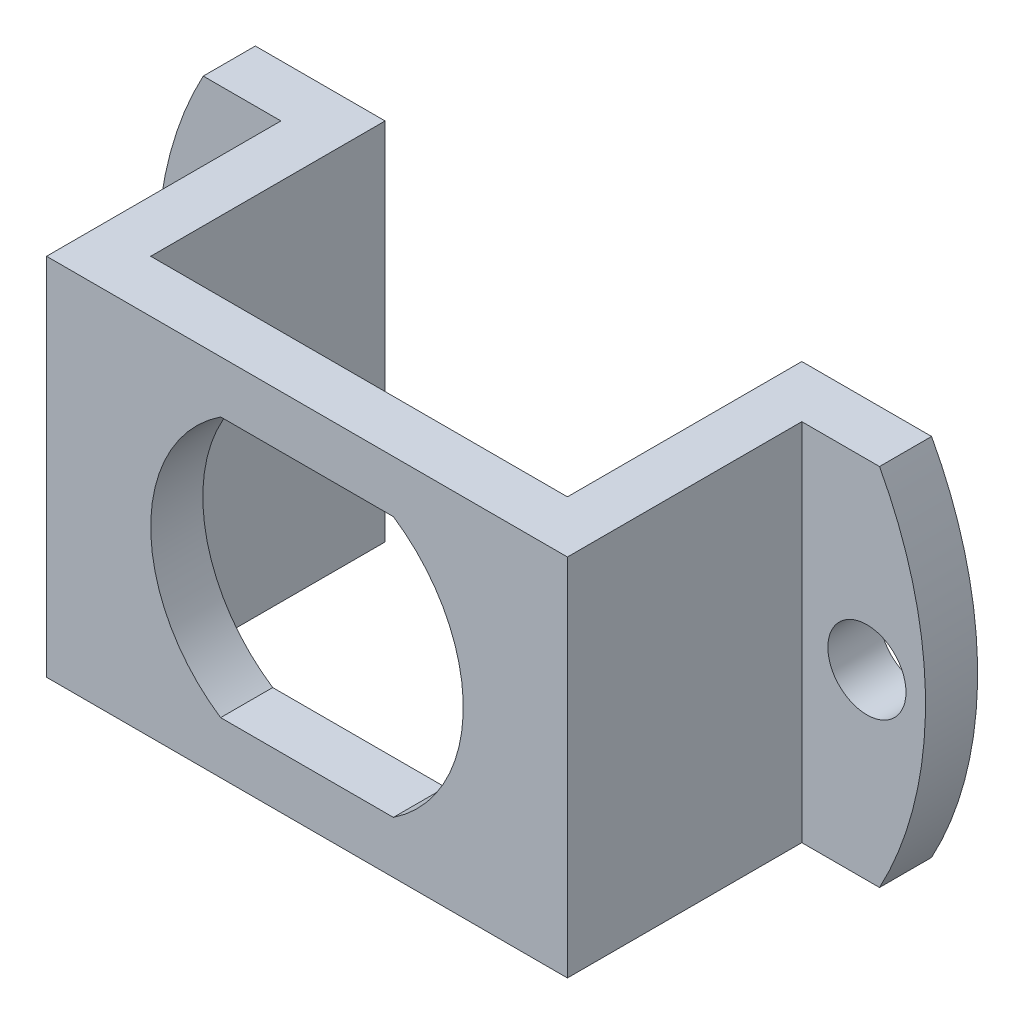
ISO-10303-21;
HEADER;
FILE_DESCRIPTION(('STEP AP214'),'2;1');
FILE_NAME('part.step','',(''),(''),'','','');
FILE_SCHEMA(('AUTOMOTIVE_DESIGN { 1 0 10303 214 1 1 1 1 }'));
ENDSEC;
DATA;
#1=APPLICATION_CONTEXT('core data for automotive mechanical design processes');
#2=APPLICATION_PROTOCOL_DEFINITION('international standard','automotive_design',2000,#1);
#3=PRODUCT_CONTEXT('',#1,'mechanical');
#4=PRODUCT('Part','Part','',(#3));
#5=PRODUCT_RELATED_PRODUCT_CATEGORY('part','',(#4));
#6=PRODUCT_DEFINITION_FORMATION('','',#4);
#7=PRODUCT_DEFINITION_CONTEXT('part definition',#1,'design');
#8=PRODUCT_DEFINITION('design','',#6,#7);
#9=PRODUCT_DEFINITION_SHAPE('','',#8);
#10=(LENGTH_UNIT() NAMED_UNIT(*) SI_UNIT(.MILLI.,.METRE.));
#11=(NAMED_UNIT(*) PLANE_ANGLE_UNIT() SI_UNIT($,.RADIAN.));
#12=(NAMED_UNIT(*) SI_UNIT($,.STERADIAN.) SOLID_ANGLE_UNIT());
#13=UNCERTAINTY_MEASURE_WITH_UNIT(LENGTH_MEASURE(1.E-05),#10,'distance_accuracy_value','');
#14=(GEOMETRIC_REPRESENTATION_CONTEXT(3) GLOBAL_UNCERTAINTY_ASSIGNED_CONTEXT((#13)) GLOBAL_UNIT_ASSIGNED_CONTEXT((#10,
#11,#12)) REPRESENTATION_CONTEXT('',''));
#15=CARTESIAN_POINT('',(0.,0.,0.));
#16=DIRECTION('',(0.,0.,1.));
#17=DIRECTION('',(1.,0.,0.));
#18=AXIS2_PLACEMENT_3D('',#15,#16,#17);
#19=CARTESIAN_POINT('',(-15.,14.,-11.));
#20=DIRECTION('',(0.,0.,1.));
#21=DIRECTION('',(1.,0.,0.));
#22=AXIS2_PLACEMENT_3D('',#19,#20,#21);
#23=PLANE('',#22);
#24=CARTESIAN_POINT('',(-12.5,7.,-11.));
#25=DIRECTION('',(0.,0.,1.));
#26=DIRECTION('',(1.,0.,0.));
#27=AXIS2_PLACEMENT_3D('',#24,#25,#26);
#28=CIRCLE('',#27,1.5);
#29=CARTESIAN_POINT('',(-11.,7.,-11.));
#30=VERTEX_POINT('',#29);
#31=EDGE_CURVE('E186',#30,#30,#28,.T.);
#32=ORIENTED_EDGE('',*,*,#31,.T.);
#33=EDGE_LOOP('',(#32));
#34=FACE_BOUND('',#33,.T.);
#35=CARTESIAN_POINT('',(0.,6.99999999999999,-11.));
#36=DIRECTION('',(0.,0.,1.));
#37=DIRECTION('',(1.,0.,0.));
#38=AXIS2_PLACEMENT_3D('',#35,#36,#37);
#39=CIRCLE('',#38,14.75);
#40=CARTESIAN_POINT('',(-12.9831621725988,14.,-11.));
#41=VERTEX_POINT('',#40);
#42=CARTESIAN_POINT('',(-12.9831621725988,0.,-11.));
#43=VERTEX_POINT('',#42);
#44=EDGE_CURVE('E54',#41,#43,#39,.T.);
#45=ORIENTED_EDGE('',*,*,#44,.F.);
#46=DIRECTION('',(-1.,0.,0.));
#47=VECTOR('',#46,1.);
#48=CARTESIAN_POINT('',(-15.,14.,-11.));
#49=LINE('',#48,#47);
#50=CARTESIAN_POINT('',(-8.,14.,-11.));
#51=VERTEX_POINT('',#50);
#52=EDGE_CURVE('E256',#51,#41,#49,.T.);
#53=ORIENTED_EDGE('',*,*,#52,.F.);
#54=DIRECTION('',(0.,-1.,0.));
#55=VECTOR('',#54,1.);
#56=CARTESIAN_POINT('',(-8.,14.,-11.));
#57=LINE('',#56,#55);
#58=CARTESIAN_POINT('',(-8.,0.,-11.));
#59=VERTEX_POINT('',#58);
#60=EDGE_CURVE('E225',#51,#59,#57,.T.);
#61=ORIENTED_EDGE('',*,*,#60,.T.);
#62=DIRECTION('',(-1.,0.,0.));
#63=VECTOR('',#62,1.);
#64=CARTESIAN_POINT('',(-15.,0.,-11.));
#65=LINE('',#64,#63);
#66=EDGE_CURVE('E185',#59,#43,#65,.T.);
#67=ORIENTED_EDGE('',*,*,#66,.T.);
#68=EDGE_LOOP('',(#45,#53,#61,#67));
#69=FACE_BOUND('',#68,.T.);
#70=ADVANCED_FACE('F39',(#34,#69),#23,.F.);
#71=CARTESIAN_POINT('',(-10.,14.,-9.));
#72=DIRECTION('',(0.,0.,-1.));
#73=DIRECTION('',(-1.,0.,0.));
#74=AXIS2_PLACEMENT_3D('',#71,#72,#73);
#75=PLANE('',#74);
#76=CARTESIAN_POINT('',(-12.5,7.,-9.));
#77=DIRECTION('',(0.,0.,-1.));
#78=DIRECTION('',(-1.,0.,0.));
#79=AXIS2_PLACEMENT_3D('',#76,#77,#78);
#80=CIRCLE('',#79,1.5);
#81=CARTESIAN_POINT('',(-14.,7.,-9.));
#82=VERTEX_POINT('',#81);
#83=EDGE_CURVE('E245',#82,#82,#80,.T.);
#84=ORIENTED_EDGE('',*,*,#83,.T.);
#85=EDGE_LOOP('',(#84));
#86=FACE_BOUND('',#85,.T.);
#87=CARTESIAN_POINT('',(0.,6.99999999999999,-9.));
#88=DIRECTION('',(0.,0.,1.));
#89=DIRECTION('',(1.,0.,0.));
#90=AXIS2_PLACEMENT_3D('',#87,#88,#89);
#91=CIRCLE('',#90,14.75);
#92=CARTESIAN_POINT('',(-12.9831621725988,14.,-9.));
#93=VERTEX_POINT('',#92);
#94=CARTESIAN_POINT('',(-12.9831621725988,0.,-9.));
#95=VERTEX_POINT('',#94);
#96=EDGE_CURVE('E156',#93,#95,#91,.T.);
#97=ORIENTED_EDGE('',*,*,#96,.T.);
#98=DIRECTION('',(1.,0.,0.));
#99=VECTOR('',#98,1.);
#100=CARTESIAN_POINT('',(-10.,0.,-9.));
#101=LINE('',#100,#99);
#102=CARTESIAN_POINT('',(-10.,0.,-9.));
#103=VERTEX_POINT('',#102);
#104=EDGE_CURVE('E189',#95,#103,#101,.T.);
#105=ORIENTED_EDGE('',*,*,#104,.T.);
#106=DIRECTION('',(0.,-1.,0.));
#107=VECTOR('',#106,1.);
#108=CARTESIAN_POINT('',(-10.,14.,-9.));
#109=LINE('',#108,#107);
#110=CARTESIAN_POINT('',(-10.,14.,-9.));
#111=VERTEX_POINT('',#110);
#112=EDGE_CURVE('E222',#111,#103,#109,.T.);
#113=ORIENTED_EDGE('',*,*,#112,.F.);
#114=DIRECTION('',(1.,0.,0.));
#115=VECTOR('',#114,1.);
#116=CARTESIAN_POINT('',(-10.,14.,-9.));
#117=LINE('',#116,#115);
#118=EDGE_CURVE('E271',#93,#111,#117,.T.);
#119=ORIENTED_EDGE('',*,*,#118,.F.);
#120=EDGE_LOOP('',(#97,#105,#113,#119));
#121=FACE_BOUND('',#120,.T.);
#122=ADVANCED_FACE('F333',(#86,#121),#75,.F.);
#123=CARTESIAN_POINT('',(10.,14.,-9.));
#124=DIRECTION('',(0.,0.,-1.));
#125=DIRECTION('',(-1.,0.,0.));
#126=AXIS2_PLACEMENT_3D('',#123,#124,#125);
#127=PLANE('',#126);
#128=CARTESIAN_POINT('',(12.5,7.,-9.));
#129=DIRECTION('',(0.,0.,-1.));
#130=DIRECTION('',(-1.,0.,0.));
#131=AXIS2_PLACEMENT_3D('',#128,#129,#130);
#132=CIRCLE('',#131,1.5);
#133=CARTESIAN_POINT('',(11.,7.,-9.));
#134=VERTEX_POINT('',#133);
#135=EDGE_CURVE('E243',#134,#134,#132,.T.);
#136=ORIENTED_EDGE('',*,*,#135,.T.);
#137=EDGE_LOOP('',(#136));
#138=FACE_BOUND('',#137,.T.);
#139=CARTESIAN_POINT('',(12.9831621725988,0.,-9.));
#140=VERTEX_POINT('',#139);
#141=CARTESIAN_POINT('',(12.9831621725988,14.,-9.));
#142=VERTEX_POINT('',#141);
#143=EDGE_CURVE('E62',#140,#142,#91,.T.);
#144=ORIENTED_EDGE('',*,*,#143,.T.);
#145=DIRECTION('',(1.,0.,0.));
#146=VECTOR('',#145,1.);
#147=CARTESIAN_POINT('',(10.,14.,-9.));
#148=LINE('',#147,#146);
#149=CARTESIAN_POINT('',(10.,14.,-9.));
#150=VERTEX_POINT('',#149);
#151=EDGE_CURVE('E164',#150,#142,#148,.T.);
#152=ORIENTED_EDGE('',*,*,#151,.F.);
#153=DIRECTION('',(0.,-1.,0.));
#154=VECTOR('',#153,1.);
#155=CARTESIAN_POINT('',(10.,14.,-9.));
#156=LINE('',#155,#154);
#157=CARTESIAN_POINT('',(10.,0.,-9.));
#158=VERTEX_POINT('',#157);
#159=EDGE_CURVE('E213',#150,#158,#156,.T.);
#160=ORIENTED_EDGE('',*,*,#159,.T.);
#161=DIRECTION('',(1.,0.,0.));
#162=VECTOR('',#161,1.);
#163=CARTESIAN_POINT('',(10.,0.,-9.));
#164=LINE('',#163,#162);
#165=EDGE_CURVE('E197',#158,#140,#164,.T.);
#166=ORIENTED_EDGE('',*,*,#165,.T.);
#167=EDGE_LOOP('',(#144,#152,#160,#166));
#168=FACE_BOUND('',#167,.T.);
#169=ADVANCED_FACE('F289',(#138,#168),#127,.F.);
#170=CARTESIAN_POINT('',(15.,14.,-11.));
#171=DIRECTION('',(0.,0.,1.));
#172=DIRECTION('',(1.,0.,0.));
#173=AXIS2_PLACEMENT_3D('',#170,#171,#172);
#174=PLANE('',#173);
#175=CARTESIAN_POINT('',(12.5,7.,-11.));
#176=DIRECTION('',(0.,0.,1.));
#177=DIRECTION('',(1.,0.,0.));
#178=AXIS2_PLACEMENT_3D('',#175,#176,#177);
#179=CIRCLE('',#178,1.5);
#180=CARTESIAN_POINT('',(14.,7.,-11.));
#181=VERTEX_POINT('',#180);
#182=EDGE_CURVE('E240',#181,#181,#179,.T.);
#183=ORIENTED_EDGE('',*,*,#182,.T.);
#184=EDGE_LOOP('',(#183));
#185=FACE_BOUND('',#184,.T.);
#186=CARTESIAN_POINT('',(12.9831621725988,0.,-11.));
#187=VERTEX_POINT('',#186);
#188=CARTESIAN_POINT('',(12.9831621725988,14.,-11.));
#189=VERTEX_POINT('',#188);
#190=EDGE_CURVE('E149',#187,#189,#39,.T.);
#191=ORIENTED_EDGE('',*,*,#190,.F.);
#192=DIRECTION('',(-1.,0.,0.));
#193=VECTOR('',#192,1.);
#194=CARTESIAN_POINT('',(15.,0.,-11.));
#195=LINE('',#194,#193);
#196=CARTESIAN_POINT('',(8.,0.,-11.));
#197=VERTEX_POINT('',#196);
#198=EDGE_CURVE('E200',#187,#197,#195,.T.);
#199=ORIENTED_EDGE('',*,*,#198,.T.);
#200=DIRECTION('',(0.,-1.,0.));
#201=VECTOR('',#200,1.);
#202=CARTESIAN_POINT('',(8.,14.,-11.));
#203=LINE('',#202,#201);
#204=CARTESIAN_POINT('',(8.,14.,-11.));
#205=VERTEX_POINT('',#204);
#206=EDGE_CURVE('E170',#205,#197,#203,.T.);
#207=ORIENTED_EDGE('',*,*,#206,.F.);
#208=DIRECTION('',(-1.,0.,0.));
#209=VECTOR('',#208,1.);
#210=CARTESIAN_POINT('',(15.,14.,-11.));
#211=LINE('',#210,#209);
#212=EDGE_CURVE('E161',#189,#205,#211,.T.);
#213=ORIENTED_EDGE('',*,*,#212,.F.);
#214=EDGE_LOOP('',(#191,#199,#207,#213));
#215=FACE_BOUND('',#214,.T.);
#216=ADVANCED_FACE('F168',(#185,#215),#174,.F.);
#217=CARTESIAN_POINT('',(0.,14.,0.));
#218=DIRECTION('',(0.,-1.,0.));
#219=DIRECTION('',(0.,0.,-1.));
#220=AXIS2_PLACEMENT_3D('',#217,#218,#219);
#221=PLANE('',#220);
#222=DIRECTION('',(0.,0.,1.));
#223=VECTOR('',#222,1.);
#224=CARTESIAN_POINT('',(12.9831621725988,14.,-11.));
#225=LINE('',#224,#223);
#226=EDGE_CURVE('E152',#189,#142,#225,.T.);
#227=ORIENTED_EDGE('',*,*,#226,.F.);
#228=ORIENTED_EDGE('',*,*,#212,.T.);
#229=DIRECTION('',(0.,0.,1.));
#230=VECTOR('',#229,1.);
#231=CARTESIAN_POINT('',(8.,14.,-11.));
#232=LINE('',#231,#230);
#233=CARTESIAN_POINT('',(8.,14.,-2.));
#234=VERTEX_POINT('',#233);
#235=EDGE_CURVE('E172',#205,#234,#232,.T.);
#236=ORIENTED_EDGE('',*,*,#235,.T.);
#237=DIRECTION('',(-1.,0.,0.));
#238=VECTOR('',#237,1.);
#239=CARTESIAN_POINT('',(8.,14.,-2.));
#240=LINE('',#239,#238);
#241=CARTESIAN_POINT('',(-8.,14.,-2.));
#242=VERTEX_POINT('',#241);
#243=EDGE_CURVE('E174',#234,#242,#240,.T.);
#244=ORIENTED_EDGE('',*,*,#243,.T.);
#245=DIRECTION('',(0.,0.,-1.));
#246=VECTOR('',#245,1.);
#247=CARTESIAN_POINT('',(-8.,14.,-11.));
#248=LINE('',#247,#246);
#249=EDGE_CURVE('E206',#242,#51,#248,.T.);
#250=ORIENTED_EDGE('',*,*,#249,.T.);
#251=ORIENTED_EDGE('',*,*,#52,.T.);
#252=DIRECTION('',(0.,0.,1.));
#253=VECTOR('',#252,1.);
#254=CARTESIAN_POINT('',(-12.9831621725988,14.,-11.));
#255=LINE('',#254,#253);
#256=EDGE_CURVE('E166',#93,#41,#255,.F.);
#257=ORIENTED_EDGE('',*,*,#256,.F.);
#258=ORIENTED_EDGE('',*,*,#118,.T.);
#259=DIRECTION('',(0.,0.,1.));
#260=VECTOR('',#259,1.);
#261=CARTESIAN_POINT('',(-10.,14.,0.));
#262=LINE('',#261,#260);
#263=CARTESIAN_POINT('',(-10.,14.,0.));
#264=VERTEX_POINT('',#263);
#265=EDGE_CURVE('E277',#111,#264,#262,.T.);
#266=ORIENTED_EDGE('',*,*,#265,.T.);
#267=DIRECTION('',(1.,0.,0.));
#268=VECTOR('',#267,1.);
#269=CARTESIAN_POINT('',(-10.,14.,0.));
#270=LINE('',#269,#268);
#271=CARTESIAN_POINT('',(10.,14.,0.));
#272=VERTEX_POINT('',#271);
#273=EDGE_CURVE('E279',#264,#272,#270,.T.);
#274=ORIENTED_EDGE('',*,*,#273,.T.);
#275=DIRECTION('',(0.,0.,-1.));
#276=VECTOR('',#275,1.);
#277=CARTESIAN_POINT('',(10.,14.,0.));
#278=LINE('',#277,#276);
#279=EDGE_CURVE('E176',#272,#150,#278,.T.);
#280=ORIENTED_EDGE('',*,*,#279,.T.);
#281=ORIENTED_EDGE('',*,*,#151,.T.);
#282=EDGE_LOOP('',(#227,#228,#236,#244,#250,#251,#257,#258,#266,#274,#280,#281));
#283=FACE_BOUND('',#282,.T.);
#284=ADVANCED_FACE('F160',(#283),#221,.F.);
#285=CARTESIAN_POINT('',(0.,0.,0.));
#286=DIRECTION('',(0.,-1.,0.));
#287=DIRECTION('',(0.,0.,-1.));
#288=AXIS2_PLACEMENT_3D('',#285,#286,#287);
#289=PLANE('',#288);
#290=ORIENTED_EDGE('',*,*,#198,.F.);
#291=DIRECTION('',(0.,0.,1.));
#292=VECTOR('',#291,1.);
#293=CARTESIAN_POINT('',(12.9831621725988,0.,-11.));
#294=LINE('',#293,#292);
#295=EDGE_CURVE('E12',#187,#140,#294,.T.);
#296=ORIENTED_EDGE('',*,*,#295,.T.);
#297=ORIENTED_EDGE('',*,*,#165,.F.);
#298=DIRECTION('',(0.,0.,-1.));
#299=VECTOR('',#298,1.);
#300=CARTESIAN_POINT('',(10.,0.,0.));
#301=LINE('',#300,#299);
#302=CARTESIAN_POINT('',(10.,0.,0.));
#303=VERTEX_POINT('',#302);
#304=EDGE_CURVE('E195',#303,#158,#301,.T.);
#305=ORIENTED_EDGE('',*,*,#304,.F.);
#306=DIRECTION('',(1.,0.,0.));
#307=VECTOR('',#306,1.);
#308=CARTESIAN_POINT('',(-10.,0.,0.));
#309=LINE('',#308,#307);
#310=CARTESIAN_POINT('',(-10.,0.,0.));
#311=VERTEX_POINT('',#310);
#312=EDGE_CURVE('E193',#311,#303,#309,.T.);
#313=ORIENTED_EDGE('',*,*,#312,.F.);
#314=DIRECTION('',(0.,0.,1.));
#315=VECTOR('',#314,1.);
#316=CARTESIAN_POINT('',(-10.,0.,0.));
#317=LINE('',#316,#315);
#318=EDGE_CURVE('E191',#103,#311,#317,.T.);
#319=ORIENTED_EDGE('',*,*,#318,.F.);
#320=ORIENTED_EDGE('',*,*,#104,.F.);
#321=DIRECTION('',(0.,0.,1.));
#322=VECTOR('',#321,1.);
#323=CARTESIAN_POINT('',(-12.9831621725988,0.,-11.));
#324=LINE('',#323,#322);
#325=EDGE_CURVE('E47',#95,#43,#324,.F.);
#326=ORIENTED_EDGE('',*,*,#325,.T.);
#327=ORIENTED_EDGE('',*,*,#66,.F.);
#328=DIRECTION('',(0.,0.,-1.));
#329=VECTOR('',#328,1.);
#330=CARTESIAN_POINT('',(-8.,0.,-11.));
#331=LINE('',#330,#329);
#332=CARTESIAN_POINT('',(-8.,0.,-2.));
#333=VERTEX_POINT('',#332);
#334=EDGE_CURVE('E182',#333,#59,#331,.T.);
#335=ORIENTED_EDGE('',*,*,#334,.F.);
#336=DIRECTION('',(-1.,0.,0.));
#337=VECTOR('',#336,1.);
#338=CARTESIAN_POINT('',(8.,0.,-2.));
#339=LINE('',#338,#337);
#340=CARTESIAN_POINT('',(8.,0.,-2.));
#341=VERTEX_POINT('',#340);
#342=EDGE_CURVE('E204',#341,#333,#339,.T.);
#343=ORIENTED_EDGE('',*,*,#342,.F.);
#344=DIRECTION('',(0.,0.,1.));
#345=VECTOR('',#344,1.);
#346=CARTESIAN_POINT('',(8.,0.,-11.));
#347=LINE('',#346,#345);
#348=EDGE_CURVE('E202',#197,#341,#347,.T.);
#349=ORIENTED_EDGE('',*,*,#348,.F.);
#350=EDGE_LOOP('',(#290,#296,#297,#305,#313,#319,#320,#326,#327,#335,#343,#349));
#351=FACE_BOUND('',#350,.T.);
#352=ADVANCED_FACE('F249',(#351),#289,.T.);
#353=CARTESIAN_POINT('',(-8.,14.,-11.));
#354=DIRECTION('',(-1.,0.,0.));
#355=DIRECTION('',(0.,0.,1.));
#356=AXIS2_PLACEMENT_3D('',#353,#354,#355);
#357=PLANE('',#356);
#358=ORIENTED_EDGE('',*,*,#334,.T.);
#359=ORIENTED_EDGE('',*,*,#60,.F.);
#360=ORIENTED_EDGE('',*,*,#249,.F.);
#361=DIRECTION('',(0.,-1.,0.));
#362=VECTOR('',#361,1.);
#363=CARTESIAN_POINT('',(-8.,14.,-2.));
#364=LINE('',#363,#362);
#365=EDGE_CURVE('E181',#242,#333,#364,.T.);
#366=ORIENTED_EDGE('',*,*,#365,.T.);
#367=EDGE_LOOP('',(#358,#359,#360,#366));
#368=FACE_BOUND('',#367,.T.);
#369=ADVANCED_FACE('F41',(#368),#357,.F.);
#370=CARTESIAN_POINT('',(-10.,14.,0.));
#371=DIRECTION('',(1.,0.,0.));
#372=DIRECTION('',(0.,0.,-1.));
#373=AXIS2_PLACEMENT_3D('',#370,#371,#372);
#374=PLANE('',#373);
#375=ORIENTED_EDGE('',*,*,#318,.T.);
#376=DIRECTION('',(0.,-1.,0.));
#377=VECTOR('',#376,1.);
#378=CARTESIAN_POINT('',(-10.,14.,0.));
#379=LINE('',#378,#377);
#380=EDGE_CURVE('E219',#264,#311,#379,.T.);
#381=ORIENTED_EDGE('',*,*,#380,.F.);
#382=ORIENTED_EDGE('',*,*,#265,.F.);
#383=ORIENTED_EDGE('',*,*,#112,.T.);
#384=EDGE_LOOP('',(#375,#381,#382,#383));
#385=FACE_BOUND('',#384,.T.);
#386=ADVANCED_FACE('F342',(#385),#374,.F.);
#387=CARTESIAN_POINT('',(-10.,14.,0.));
#388=DIRECTION('',(0.,0.,-1.));
#389=DIRECTION('',(-1.,0.,0.));
#390=AXIS2_PLACEMENT_3D('',#387,#388,#389);
#391=PLANE('',#390);
#392=DIRECTION('',(1.,0.,0.));
#393=VECTOR('',#392,1.);
#394=CARTESIAN_POINT('',(-3.3166247903554,2.,0.));
#395=LINE('',#394,#393);
#396=CARTESIAN_POINT('',(-3.3166247903554,2.,0.));
#397=VERTEX_POINT('',#396);
#398=CARTESIAN_POINT('',(3.3166247903554,2.,0.));
#399=VERTEX_POINT('',#398);
#400=EDGE_CURVE('E294',#397,#399,#395,.T.);
#401=ORIENTED_EDGE('',*,*,#400,.F.);
#402=CARTESIAN_POINT('',(0.,7.,0.));
#403=DIRECTION('',(0.,0.,1.));
#404=DIRECTION('',(1.,0.,0.));
#405=AXIS2_PLACEMENT_3D('',#402,#403,#404);
#406=CIRCLE('',#405,6.);
#407=CARTESIAN_POINT('',(-3.3166247903554,12.,0.));
#408=VERTEX_POINT('',#407);
#409=EDGE_CURVE('E165',#408,#397,#406,.T.);
#410=ORIENTED_EDGE('',*,*,#409,.F.);
#411=DIRECTION('',(-1.,0.,0.));
#412=VECTOR('',#411,1.);
#413=CARTESIAN_POINT('',(-3.3166247903554,12.,0.));
#414=LINE('',#413,#412);
#415=CARTESIAN_POINT('',(3.3166247903554,12.,0.));
#416=VERTEX_POINT('',#415);
#417=EDGE_CURVE('E300',#416,#408,#414,.T.);
#418=ORIENTED_EDGE('',*,*,#417,.F.);
#419=CARTESIAN_POINT('',(0.,7.,0.));
#420=DIRECTION('',(0.,0.,1.));
#421=DIRECTION('',(1.,0.,0.));
#422=AXIS2_PLACEMENT_3D('',#419,#420,#421);
#423=CIRCLE('',#422,6.);
#424=EDGE_CURVE('E297',#399,#416,#423,.T.);
#425=ORIENTED_EDGE('',*,*,#424,.F.);
#426=EDGE_LOOP('',(#401,#410,#418,#425));
#427=FACE_BOUND('',#426,.T.);
#428=ORIENTED_EDGE('',*,*,#312,.T.);
#429=DIRECTION('',(0.,-1.,0.));
#430=VECTOR('',#429,1.);
#431=CARTESIAN_POINT('',(10.,14.,0.));
#432=LINE('',#431,#430);
#433=EDGE_CURVE('E216',#272,#303,#432,.T.);
#434=ORIENTED_EDGE('',*,*,#433,.F.);
#435=ORIENTED_EDGE('',*,*,#273,.F.);
#436=ORIENTED_EDGE('',*,*,#380,.T.);
#437=EDGE_LOOP('',(#428,#434,#435,#436));
#438=FACE_BOUND('',#437,.T.);
#439=ADVANCED_FACE('F345',(#427,#438),#391,.F.);
#440=CARTESIAN_POINT('',(10.,14.,0.));
#441=DIRECTION('',(-1.,0.,0.));
#442=DIRECTION('',(0.,0.,1.));
#443=AXIS2_PLACEMENT_3D('',#440,#441,#442);
#444=PLANE('',#443);
#445=ORIENTED_EDGE('',*,*,#304,.T.);
#446=ORIENTED_EDGE('',*,*,#159,.F.);
#447=ORIENTED_EDGE('',*,*,#279,.F.);
#448=ORIENTED_EDGE('',*,*,#433,.T.);
#449=EDGE_LOOP('',(#445,#446,#447,#448));
#450=FACE_BOUND('',#449,.T.);
#451=ADVANCED_FACE('F285',(#450),#444,.F.);
#452=CARTESIAN_POINT('',(8.,14.,-11.));
#453=DIRECTION('',(1.,0.,0.));
#454=DIRECTION('',(0.,0.,-1.));
#455=AXIS2_PLACEMENT_3D('',#452,#453,#454);
#456=PLANE('',#455);
#457=ORIENTED_EDGE('',*,*,#348,.T.);
#458=DIRECTION('',(0.,-1.,0.));
#459=VECTOR('',#458,1.);
#460=CARTESIAN_POINT('',(8.,14.,-2.));
#461=LINE('',#460,#459);
#462=EDGE_CURVE('E209',#234,#341,#461,.T.);
#463=ORIENTED_EDGE('',*,*,#462,.F.);
#464=ORIENTED_EDGE('',*,*,#235,.F.);
#465=ORIENTED_EDGE('',*,*,#206,.T.);
#466=EDGE_LOOP('',(#457,#463,#464,#465));
#467=FACE_BOUND('',#466,.T.);
#468=ADVANCED_FACE('F268',(#467),#456,.F.);
#469=CARTESIAN_POINT('',(8.,14.,-2.));
#470=DIRECTION('',(0.,0.,1.));
#471=DIRECTION('',(1.,0.,0.));
#472=AXIS2_PLACEMENT_3D('',#469,#470,#471);
#473=PLANE('',#472);
#474=DIRECTION('',(-1.,0.,0.));
#475=VECTOR('',#474,1.);
#476=CARTESIAN_POINT('',(8.,12.,-2.));
#477=LINE('',#476,#475);
#478=CARTESIAN_POINT('',(3.3166247903554,12.,-2.));
#479=VERTEX_POINT('',#478);
#480=CARTESIAN_POINT('',(-3.3166247903554,12.,-2.));
#481=VERTEX_POINT('',#480);
#482=EDGE_CURVE('E234',#479,#481,#477,.T.);
#483=ORIENTED_EDGE('',*,*,#482,.T.);
#484=CARTESIAN_POINT('',(0.,7.,-2.));
#485=DIRECTION('',(0.,0.,1.));
#486=DIRECTION('',(1.,0.,0.));
#487=AXIS2_PLACEMENT_3D('',#484,#485,#486);
#488=CIRCLE('',#487,6.);
#489=CARTESIAN_POINT('',(-3.3166247903554,2.,-2.));
#490=VERTEX_POINT('',#489);
#491=EDGE_CURVE('E237',#481,#490,#488,.T.);
#492=ORIENTED_EDGE('',*,*,#491,.T.);
#493=DIRECTION('',(1.,0.,0.));
#494=VECTOR('',#493,1.);
#495=CARTESIAN_POINT('',(8.,2.,-2.));
#496=LINE('',#495,#494);
#497=CARTESIAN_POINT('',(3.3166247903554,2.,-2.));
#498=VERTEX_POINT('',#497);
#499=EDGE_CURVE('E228',#490,#498,#496,.T.);
#500=ORIENTED_EDGE('',*,*,#499,.T.);
#501=CARTESIAN_POINT('',(0.,7.,-2.));
#502=DIRECTION('',(0.,0.,1.));
#503=DIRECTION('',(1.,0.,0.));
#504=AXIS2_PLACEMENT_3D('',#501,#502,#503);
#505=CIRCLE('',#504,6.);
#506=EDGE_CURVE('E231',#498,#479,#505,.T.);
#507=ORIENTED_EDGE('',*,*,#506,.T.);
#508=EDGE_LOOP('',(#483,#492,#500,#507));
#509=FACE_BOUND('',#508,.T.);
#510=ORIENTED_EDGE('',*,*,#342,.T.);
#511=ORIENTED_EDGE('',*,*,#365,.F.);
#512=ORIENTED_EDGE('',*,*,#243,.F.);
#513=ORIENTED_EDGE('',*,*,#462,.T.);
#514=EDGE_LOOP('',(#510,#511,#512,#513));
#515=FACE_BOUND('',#514,.T.);
#516=ADVANCED_FACE('F264',(#509,#515),#473,.F.);
#517=CARTESIAN_POINT('',(0.,7.,-14.));
#518=DIRECTION('',(0.,0.,1.));
#519=DIRECTION('',(1.,0.,0.));
#520=AXIS2_PLACEMENT_3D('',#517,#518,#519);
#521=CYLINDRICAL_SURFACE('',#520,6.);
#522=DIRECTION('',(0.,0.,1.));
#523=VECTOR('',#522,1.);
#524=CARTESIAN_POINT('',(-3.3166247903554,12.,-14.));
#525=LINE('',#524,#523);
#526=EDGE_CURVE('E244',#481,#408,#525,.T.);
#527=ORIENTED_EDGE('',*,*,#526,.T.);
#528=ORIENTED_EDGE('',*,*,#409,.T.);
#529=DIRECTION('',(0.,0.,1.));
#530=VECTOR('',#529,1.);
#531=CARTESIAN_POINT('',(-3.3166247903554,2.,-14.));
#532=LINE('',#531,#530);
#533=EDGE_CURVE('E303',#490,#397,#532,.T.);
#534=ORIENTED_EDGE('',*,*,#533,.F.);
#535=ORIENTED_EDGE('',*,*,#491,.F.);
#536=EDGE_LOOP('',(#527,#528,#534,#535));
#537=FACE_BOUND('',#536,.T.);
#538=ADVANCED_FACE('F361',(#537),#521,.F.);
#539=CARTESIAN_POINT('',(-3.3166247903554,12.,-14.));
#540=DIRECTION('',(0.,1.,0.));
#541=DIRECTION('',(0.,0.,1.));
#542=AXIS2_PLACEMENT_3D('',#539,#540,#541);
#543=PLANE('',#542);
#544=DIRECTION('',(0.,0.,1.));
#545=VECTOR('',#544,1.);
#546=CARTESIAN_POINT('',(3.3166247903554,12.,-14.));
#547=LINE('',#546,#545);
#548=EDGE_CURVE('E305',#479,#416,#547,.T.);
#549=ORIENTED_EDGE('',*,*,#548,.T.);
#550=ORIENTED_EDGE('',*,*,#417,.T.);
#551=ORIENTED_EDGE('',*,*,#526,.F.);
#552=ORIENTED_EDGE('',*,*,#482,.F.);
#553=EDGE_LOOP('',(#549,#550,#551,#552));
#554=FACE_BOUND('',#553,.T.);
#555=ADVANCED_FACE('F368',(#554),#543,.F.);
#556=CARTESIAN_POINT('',(0.,7.,-14.));
#557=DIRECTION('',(0.,0.,1.));
#558=DIRECTION('',(1.,0.,0.));
#559=AXIS2_PLACEMENT_3D('',#556,#557,#558);
#560=CYLINDRICAL_SURFACE('',#559,6.);
#561=DIRECTION('',(0.,0.,1.));
#562=VECTOR('',#561,1.);
#563=CARTESIAN_POINT('',(3.3166247903554,2.,-14.));
#564=LINE('',#563,#562);
#565=EDGE_CURVE('E307',#498,#399,#564,.T.);
#566=ORIENTED_EDGE('',*,*,#565,.T.);
#567=ORIENTED_EDGE('',*,*,#424,.T.);
#568=ORIENTED_EDGE('',*,*,#548,.F.);
#569=ORIENTED_EDGE('',*,*,#506,.F.);
#570=EDGE_LOOP('',(#566,#567,#568,#569));
#571=FACE_BOUND('',#570,.T.);
#572=ADVANCED_FACE('F327',(#571),#560,.F.);
#573=CARTESIAN_POINT('',(-3.3166247903554,2.,-14.));
#574=DIRECTION('',(0.,-1.,0.));
#575=DIRECTION('',(0.,0.,-1.));
#576=AXIS2_PLACEMENT_3D('',#573,#574,#575);
#577=PLANE('',#576);
#578=ORIENTED_EDGE('',*,*,#533,.T.);
#579=ORIENTED_EDGE('',*,*,#400,.T.);
#580=ORIENTED_EDGE('',*,*,#565,.F.);
#581=ORIENTED_EDGE('',*,*,#499,.F.);
#582=EDGE_LOOP('',(#578,#579,#580,#581));
#583=FACE_BOUND('',#582,.T.);
#584=ADVANCED_FACE('F317',(#583),#577,.F.);
#585=CARTESIAN_POINT('',(12.5,7.,-14.));
#586=DIRECTION('',(0.,0.,1.));
#587=DIRECTION('',(1.,0.,0.));
#588=AXIS2_PLACEMENT_3D('',#585,#586,#587);
#589=CYLINDRICAL_SURFACE('',#588,1.5);
#590=ORIENTED_EDGE('',*,*,#182,.F.);
#591=EDGE_LOOP('',(#590));
#592=FACE_BOUND('',#591,.T.);
#593=ORIENTED_EDGE('',*,*,#135,.F.);
#594=EDGE_LOOP('',(#593));
#595=FACE_BOUND('',#594,.T.);
#596=ADVANCED_FACE('F314',(#592,#595),#589,.F.);
#597=CARTESIAN_POINT('',(-12.5,7.,-14.));
#598=DIRECTION('',(0.,0.,1.));
#599=DIRECTION('',(1.,0.,0.));
#600=AXIS2_PLACEMENT_3D('',#597,#598,#599);
#601=CYLINDRICAL_SURFACE('',#600,1.5);
#602=ORIENTED_EDGE('',*,*,#83,.F.);
#603=EDGE_LOOP('',(#602));
#604=FACE_BOUND('',#603,.T.);
#605=ORIENTED_EDGE('',*,*,#31,.F.);
#606=EDGE_LOOP('',(#605));
#607=FACE_BOUND('',#606,.T.);
#608=ADVANCED_FACE('F316',(#604,#607),#601,.F.);
#609=CARTESIAN_POINT('',(0.,6.99999999999999,-11.));
#610=DIRECTION('',(0.,0.,1.));
#611=DIRECTION('',(1.,0.,0.));
#612=AXIS2_PLACEMENT_3D('',#609,#610,#611);
#613=CYLINDRICAL_SURFACE('',#612,14.75);
#614=ORIENTED_EDGE('',*,*,#256,.T.);
#615=ORIENTED_EDGE('',*,*,#44,.T.);
#616=ORIENTED_EDGE('',*,*,#325,.F.);
#617=ORIENTED_EDGE('',*,*,#96,.F.);
#618=EDGE_LOOP('',(#614,#615,#616,#617));
#619=FACE_BOUND('',#618,.T.);
#620=ADVANCED_FACE('F324',(#619),#613,.T.);
#621=ORIENTED_EDGE('',*,*,#226,.T.);
#622=ORIENTED_EDGE('',*,*,#143,.F.);
#623=ORIENTED_EDGE('',*,*,#295,.F.);
#624=ORIENTED_EDGE('',*,*,#190,.T.);
#625=EDGE_LOOP('',(#621,#622,#623,#624));
#626=FACE_BOUND('',#625,.T.);
#627=ADVANCED_FACE('F151',(#626),#613,.T.);
#628=CLOSED_SHELL('',(#70,#122,#169,#216,#284,#352,#369,#386,#439,#451,#468,#516,#538,#555,#572,
#584,#596,#608,#620,#627));
#629=MANIFOLD_SOLID_BREP('B2',#628);
#630=ADVANCED_BREP_SHAPE_REPRESENTATION('',(#18,#629),#14);
#631=SHAPE_DEFINITION_REPRESENTATION(#9,#630);
ENDSEC;
END-ISO-10303-21;
